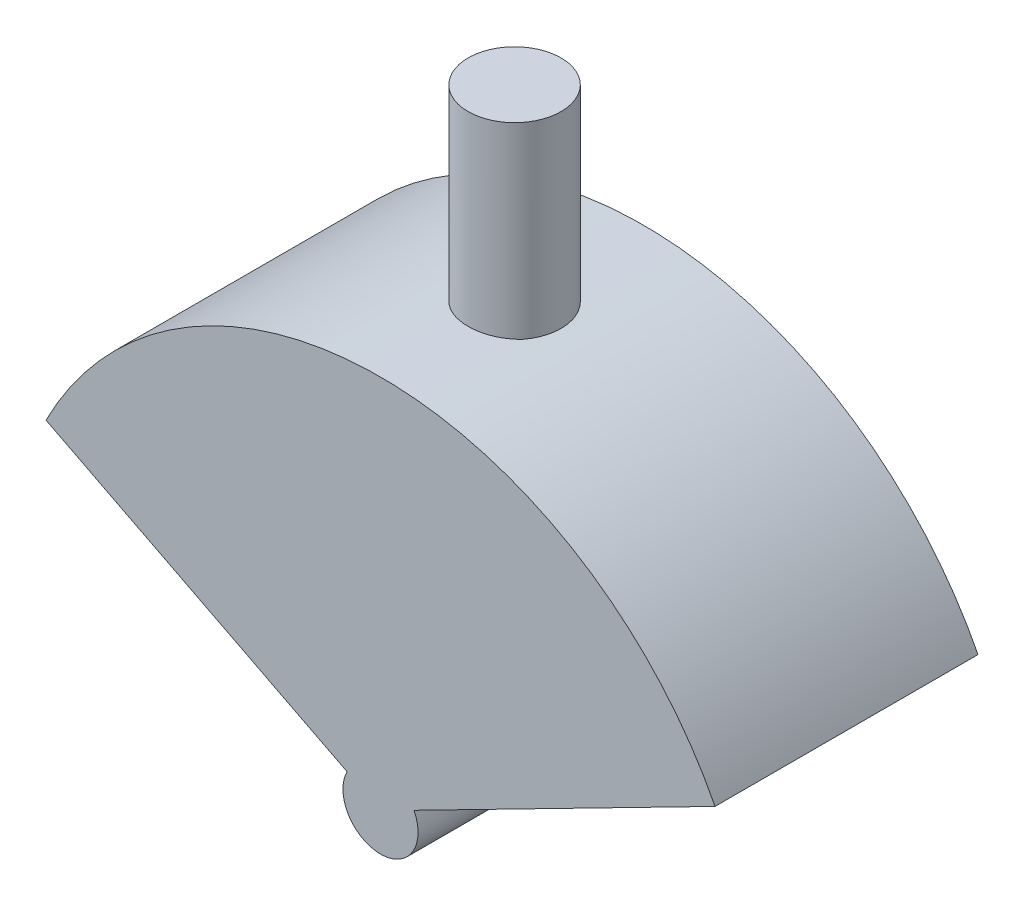
ISO-10303-21;
HEADER;
FILE_DESCRIPTION(('STEP AP214'),'2;1');
FILE_NAME('part.step','',(''),(''),'','','');
FILE_SCHEMA(('AUTOMOTIVE_DESIGN { 1 0 10303 214 1 1 1 1 }'));
ENDSEC;
DATA;
#1=APPLICATION_CONTEXT('core data for automotive mechanical design processes');
#2=APPLICATION_PROTOCOL_DEFINITION('international standard','automotive_design',2000,#1);
#3=PRODUCT_CONTEXT('',#1,'mechanical');
#4=PRODUCT('Part','Part','',(#3));
#5=PRODUCT_RELATED_PRODUCT_CATEGORY('part','',(#4));
#6=PRODUCT_DEFINITION_FORMATION('','',#4);
#7=PRODUCT_DEFINITION_CONTEXT('part definition',#1,'design');
#8=PRODUCT_DEFINITION('design','',#6,#7);
#9=PRODUCT_DEFINITION_SHAPE('','',#8);
#10=(LENGTH_UNIT() NAMED_UNIT(*) SI_UNIT(.MILLI.,.METRE.));
#11=(NAMED_UNIT(*) PLANE_ANGLE_UNIT() SI_UNIT($,.RADIAN.));
#12=(NAMED_UNIT(*) SI_UNIT($,.STERADIAN.) SOLID_ANGLE_UNIT());
#13=UNCERTAINTY_MEASURE_WITH_UNIT(LENGTH_MEASURE(1.E-05),#10,'distance_accuracy_value','');
#14=(GEOMETRIC_REPRESENTATION_CONTEXT(3) GLOBAL_UNCERTAINTY_ASSIGNED_CONTEXT((#13)) GLOBAL_UNIT_ASSIGNED_CONTEXT((#10,
#11,#12)) REPRESENTATION_CONTEXT('',''));
#15=CARTESIAN_POINT('',(0.,0.,0.));
#16=DIRECTION('',(0.,0.,1.));
#17=DIRECTION('',(1.,0.,0.));
#18=AXIS2_PLACEMENT_3D('',#15,#16,#17);
#19=CARTESIAN_POINT('',(0.,0.,35.));
#20=DIRECTION('',(0.,0.,-1.));
#21=DIRECTION('',(-1.,0.,0.));
#22=AXIS2_PLACEMENT_3D('',#19,#20,#21);
#23=CYLINDRICAL_SURFACE('',#22,50.);
#24=CARTESIAN_POINT('',(0.,0.,0.));
#25=DIRECTION('',(0.,0.,1.));
#26=DIRECTION('',(1.,0.,0.));
#27=AXIS2_PLACEMENT_3D('',#24,#25,#26);
#28=CIRCLE('',#27,50.);
#29=CARTESIAN_POINT('',(44.5203538997681,22.7582531983324,0.));
#30=VERTEX_POINT('',#29);
#31=CARTESIAN_POINT('',(-44.5203538997681,22.7582531983324,0.));
#32=VERTEX_POINT('',#31);
#33=EDGE_CURVE('E168',#30,#32,#28,.T.);
#34=ORIENTED_EDGE('',*,*,#33,.T.);
#35=DIRECTION('',(0.,0.,-1.));
#36=VECTOR('',#35,1.);
#37=CARTESIAN_POINT('',(-44.5203538997681,22.7582531983324,35.));
#38=LINE('',#37,#36);
#39=CARTESIAN_POINT('',(-44.5203538997681,22.7582531983324,35.));
#40=VERTEX_POINT('',#39);
#41=EDGE_CURVE('E166',#40,#32,#38,.T.);
#42=ORIENTED_EDGE('',*,*,#41,.F.);
#43=CARTESIAN_POINT('',(0.,0.,35.));
#44=DIRECTION('',(0.,0.,1.));
#45=DIRECTION('',(1.,0.,0.));
#46=AXIS2_PLACEMENT_3D('',#43,#44,#45);
#47=CIRCLE('',#46,50.);
#48=CARTESIAN_POINT('',(44.5203538997681,22.7582531983324,35.));
#49=VERTEX_POINT('',#48);
#50=EDGE_CURVE('E160',#49,#40,#47,.T.);
#51=ORIENTED_EDGE('',*,*,#50,.F.);
#52=DIRECTION('',(0.,0.,-1.));
#53=VECTOR('',#52,1.);
#54=CARTESIAN_POINT('',(44.5203538997681,22.7582531983324,35.));
#55=LINE('',#54,#53);
#56=EDGE_CURVE('E173',#49,#30,#55,.T.);
#57=ORIENTED_EDGE('',*,*,#56,.T.);
#58=EDGE_LOOP('',(#34,#42,#51,#57));
#59=FACE_BOUND('',#58,.T.);
#60=DIRECTION('',(0.,0.,-1.));
#61=VECTOR('',#60,1.);
#62=CARTESIAN_POINT('',(4.91211680804662,49.7581260545864,35.));
#63=LINE('',#62,#61);
#64=CARTESIAN_POINT('',(4.91211680804662,49.7581260545864,20.9213556774108));
#65=VERTEX_POINT('',#64);
#66=CARTESIAN_POINT('',(4.91211680804662,49.7581260545864,13.3931153032548));
#67=VERTEX_POINT('',#66);
#68=EDGE_CURVE('E11',#65,#67,#63,.T.);
#69=ORIENTED_EDGE('',*,*,#68,.F.);
#70=CARTESIAN_POINT('',(-4.91211680804662,49.7581260545864,20.9213556774108));
#71=CARTESIAN_POINT('',(-4.80620701915008,49.768581992461,21.0595951789052));
#72=CARTESIAN_POINT('',(-4.6944457010717,49.7792732648972,21.1933289110093));
#73=CARTESIAN_POINT('',(-4.46006910687504,49.8008194176482,21.4508976429164));
#74=CARTESIAN_POINT('',(-4.33745424601258,49.8116742916903,21.5747330210851));
#75=CARTESIAN_POINT('',(-4.08226643114797,49.8332367862117,21.8115775186441));
#76=CARTESIAN_POINT('',(-3.94969779104648,49.8439444681296,21.9245912802807));
#77=CARTESIAN_POINT('',(-3.67548822916328,49.8649144069012,22.1390595341949));
#78=CARTESIAN_POINT('',(-3.53384742874115,49.8751766697102,22.2405141810501));
#79=CARTESIAN_POINT('',(-3.24242903018518,49.894969553256,22.4311787549201));
#80=CARTESIAN_POINT('',(-3.09264852672002,49.9044999097829,22.5203842692097));
#81=CARTESIAN_POINT('',(-2.78599293414671,49.9225584189874,22.6858975734275));
#82=CARTESIAN_POINT('',(-2.62911524710225,49.9310862004923,22.7622005911538));
#83=CARTESIAN_POINT('',(-2.30953071719396,49.9468882304505,22.9012679367591));
#84=CARTESIAN_POINT('',(-2.14682776259052,49.9541632968979,22.9640411061105));
#85=CARTESIAN_POINT('',(-1.81659161435436,49.9672623676919,23.0756708580432));
#86=CARTESIAN_POINT('',(-1.64905667727406,49.9730858407866,23.124522346524));
#87=CARTESIAN_POINT('',(-1.3110879546694,49.9830922785509,23.2077484956979));
#88=CARTESIAN_POINT('',(-1.14066834288643,49.9872816736069,23.2421799420919));
#89=CARTESIAN_POINT('',(-0.797500502225785,49.9939340697915,23.2965894152695));
#90=CARTESIAN_POINT('',(-0.624752235587804,49.996397042891,23.3165672073921));
#91=CARTESIAN_POINT('',(-0.278153752977896,49.9995266779115,23.3419197344905));
#92=CARTESIAN_POINT('',(-0.104303428435538,50.0001931600035,23.3472930075515));
#93=CARTESIAN_POINT('',(0.243229966348021,49.9997103370352,23.3433918001177));
#94=CARTESIAN_POINT('',(0.416913037121793,49.998561037776,23.3341173664196));
#95=CARTESIAN_POINT('',(0.7618462770107,49.9944913583161,23.3010880399054));
#96=CARTESIAN_POINT('',(0.933104740989708,49.991581406325,23.2774184045198));
#97=CARTESIAN_POINT('',(1.27300297588202,49.9840810758099,23.2158480016475));
#98=CARTESIAN_POINT('',(1.44164279832232,49.9794907303948,23.1779475145517));
#99=CARTESIAN_POINT('',(1.77517227279307,49.9687563818222,23.0881790031677));
#100=CARTESIAN_POINT('',(1.94006065254528,49.9626118598904,23.0363063146708));
#101=CARTESIAN_POINT('',(2.26481312288888,49.9489442111383,22.9189982190943));
#102=CARTESIAN_POINT('',(2.42467899787396,49.9414215805716,22.853567693052));
#103=CARTESIAN_POINT('',(2.73881233313676,49.9251812329888,22.7093843772907));
#104=CARTESIAN_POINT('',(2.89306129753909,49.9164599525572,22.6305916939926));
#105=CARTESIAN_POINT('',(3.1943183180678,49.8980871306041,22.460417631336));
#106=CARTESIAN_POINT('',(3.34132898427833,49.888435928174,22.3690408355329));
#107=CARTESIAN_POINT('',(3.627058603943,49.8684764860698,22.1743862847947));
#108=CARTESIAN_POINT('',(3.7657828737228,49.8581686766238,22.0711162875079));
#109=CARTESIAN_POINT('',(4.03404059773329,49.8371810334588,21.8533871120754));
#110=CARTESIAN_POINT('',(4.16357753065753,49.8265013428574,21.7389322084392));
#111=CARTESIAN_POINT('',(4.40081014209718,49.8060806926605,21.5109459921894));
#112=CARTESIAN_POINT('',(4.50941228122517,49.7963466948666,21.3983552498156));
#113=CARTESIAN_POINT('',(4.71760098750933,49.7770545045737,21.1654911842859));
#114=CARTESIAN_POINT('',(4.81720395534327,49.7674960186319,21.0452325472429));
#115=CARTESIAN_POINT('',(4.91211680804662,49.7581260545864,20.9213556774108));
#116=B_SPLINE_CURVE_WITH_KNOTS('',3,(#70,#71,#72,#73,#74,#75,#76,#77,#78,#79,#80,#81,#82,#83,
#84,#85,#86,#87,#88,#89,#90,#91,#92,#93,#94,#95,#96,#97,#98,#99,#100,#101,#102,#103,#104,#105,
#106,#107,#108,#109,#110,#111,#112,#113,#114,#115),.UNSPECIFIED.,.F.,.F.,(4,2,2,2,2,2,2,2,2,2,2,
2,2,2,2,2,2,2,2,2,2,2,4),(0.,0.523220667167646,1.04642132459313,1.56939652488271,
2.09236473071928,2.61552084327804,3.13887003253789,3.66187618014962,4.18507345661864,
4.70619057105258,5.22731614584907,5.74849388348016,6.26966995605141,6.78778895537969,
7.30589774673161,7.82417970827913,8.34227540324886,8.86194605221607,9.38142791788532,
9.90057283700348,10.4195201258956,10.8892833054004,11.358172319868),.UNSPECIFIED.);
#117=CARTESIAN_POINT('',(-4.91211680804662,49.7581260545864,20.9213556774108));
#118=VERTEX_POINT('',#117);
#119=EDGE_CURVE('E41',#118,#65,#116,.T.);
#120=ORIENTED_EDGE('',*,*,#119,.F.);
#121=DIRECTION('',(0.,0.,-1.));
#122=VECTOR('',#121,1.);
#123=CARTESIAN_POINT('',(-4.91211680804662,49.7581260545864,35.));
#124=LINE('',#123,#122);
#125=CARTESIAN_POINT('',(-4.91211680804662,49.7581260545864,13.3931153032548));
#126=VERTEX_POINT('',#125);
#127=EDGE_CURVE('E104',#126,#118,#124,.F.);
#128=ORIENTED_EDGE('',*,*,#127,.F.);
#129=CARTESIAN_POINT('',(4.91211680804662,49.7581260545864,13.3931153032548));
#130=CARTESIAN_POINT('',(4.80620701915008,49.768581992461,13.2548758017605));
#131=CARTESIAN_POINT('',(4.6944457010717,49.7792732648972,13.1211420696564));
#132=CARTESIAN_POINT('',(4.46006910687504,49.8008194176482,12.8635733377493));
#133=CARTESIAN_POINT('',(4.33745424601258,49.8116742916903,12.7397379595806));
#134=CARTESIAN_POINT('',(4.08226643114798,49.8332367862117,12.5028934620215));
#135=CARTESIAN_POINT('',(3.94969779104648,49.8439444681296,12.389879700385));
#136=CARTESIAN_POINT('',(3.67548822916328,49.8649144069012,12.1754114464707));
#137=CARTESIAN_POINT('',(3.53384742874115,49.8751766697102,12.0739567996156));
#138=CARTESIAN_POINT('',(3.24242903018518,49.894969553256,11.8832922257455));
#139=CARTESIAN_POINT('',(3.09264852672002,49.9044999097829,11.7940867114559));
#140=CARTESIAN_POINT('',(2.78599293414671,49.9225584189874,11.6285734072381));
#141=CARTESIAN_POINT('',(2.62911524710225,49.9310862004923,11.5522703895119));
#142=CARTESIAN_POINT('',(2.30953071719396,49.9468882304505,11.4132030439065));
#143=CARTESIAN_POINT('',(2.14682776259052,49.9541632968979,11.3504298745551));
#144=CARTESIAN_POINT('',(1.81659161435436,49.9672623676919,11.2388001226225));
#145=CARTESIAN_POINT('',(1.64905667727406,49.9730858407866,11.1899486341416));
#146=CARTESIAN_POINT('',(1.3110879546694,49.9830922785509,11.1067224849677));
#147=CARTESIAN_POINT('',(1.14066834288643,49.9872816736069,11.0722910385738));
#148=CARTESIAN_POINT('',(0.797500502225787,49.9939340697915,11.0178815653962));
#149=CARTESIAN_POINT('',(0.624752235587806,49.996397042891,10.9979037732736));
#150=CARTESIAN_POINT('',(0.278153752977897,49.9995266779115,10.9725512461752));
#151=CARTESIAN_POINT('',(0.104303428435539,50.0001931600035,10.9671779731142));
#152=CARTESIAN_POINT('',(-0.243229966348021,49.9997103370352,10.9710791805479));
#153=CARTESIAN_POINT('',(-0.416913037121793,49.998561037776,10.9803536142461));
#154=CARTESIAN_POINT('',(-0.761846277010699,49.9944913583161,11.0133829407602));
#155=CARTESIAN_POINT('',(-0.933104740989707,49.991581406325,11.0370525761458));
#156=CARTESIAN_POINT('',(-1.27300297588202,49.9840810758099,11.0986229790181));
#157=CARTESIAN_POINT('',(-1.44164279832232,49.9794907303948,11.1365234661139));
#158=CARTESIAN_POINT('',(-1.77517227279307,49.9687563818222,11.226291977498));
#159=CARTESIAN_POINT('',(-1.94006065254528,49.9626118598904,11.2781646659948));
#160=CARTESIAN_POINT('',(-2.26481312288888,49.9489442111383,11.3954727615714));
#161=CARTESIAN_POINT('',(-2.42467899787396,49.9414215805716,11.4609032876136));
#162=CARTESIAN_POINT('',(-2.73881233313676,49.9251812329888,11.605086603375));
#163=CARTESIAN_POINT('',(-2.89306129753908,49.9164599525572,11.6838792866731));
#164=CARTESIAN_POINT('',(-3.1943183180678,49.8980871306041,11.8540533493296));
#165=CARTESIAN_POINT('',(-3.34132898427833,49.888435928174,11.9454301451327));
#166=CARTESIAN_POINT('',(-3.627058603943,49.8684764860698,12.1400846958709));
#167=CARTESIAN_POINT('',(-3.7657828737228,49.8581686766238,12.2433546931578));
#168=CARTESIAN_POINT('',(-4.03404059773329,49.8371810334588,12.4610838685902));
#169=CARTESIAN_POINT('',(-4.16357753065753,49.8265013428574,12.5755387722265));
#170=CARTESIAN_POINT('',(-4.40081014209718,49.8060806926605,12.8035249884763));
#171=CARTESIAN_POINT('',(-4.50941228122517,49.7963466948666,12.9161157308501));
#172=CARTESIAN_POINT('',(-4.71760098750933,49.7770545045737,13.1489797963797));
#173=CARTESIAN_POINT('',(-4.81720395534327,49.7674960186319,13.2692384334227));
#174=CARTESIAN_POINT('',(-4.91211680804662,49.7581260545864,13.3931153032548));
#175=B_SPLINE_CURVE_WITH_KNOTS('',3,(#129,#130,#131,#132,#133,#134,#135,#136,#137,#138,#139,
#140,#141,#142,#143,#144,#145,#146,#147,#148,#149,#150,#151,#152,#153,#154,#155,#156,#157,#158,
#159,#160,#161,#162,#163,#164,#165,#166,#167,#168,#169,#170,#171,#172,#173,#174),.UNSPECIFIED.,
.F.,.F.,(4,2,2,2,2,2,2,2,2,2,2,2,2,2,2,2,2,2,2,2,2,2,4),(0.,0.523220667167642,1.04642132459313,
1.56939652488271,2.09236473071928,2.61552084327804,3.13887003253789,3.66187618014962,
4.18507345661864,4.70619057105258,5.22731614584906,5.74849388348016,6.26966995605141,
6.78778895537969,7.30589774673161,7.82417970827912,8.34227540324885,8.86194605221606,
9.38142791788532,9.90057283700348,10.4195201258956,10.8892833054004,11.358172319868),.UNSPECIFIED.);
#176=EDGE_CURVE('E51',#67,#126,#175,.T.);
#177=ORIENTED_EDGE('',*,*,#176,.F.);
#178=EDGE_LOOP('',(#69,#120,#128,#177));
#179=FACE_BOUND('',#178,.T.);
#180=ADVANCED_FACE('F33',(#59,#179),#23,.T.);
#181=CARTESIAN_POINT('',(0.,0.,35.));
#182=DIRECTION('',(-0.455165063966648,0.890407077995361,0.));
#183=DIRECTION('',(-0.890407077995361,-0.455165063966648,0.));
#184=AXIS2_PLACEMENT_3D('',#181,#182,#183);
#185=PLANE('',#184);
#186=DIRECTION('',(0.890407077995361,0.455165063966648,0.));
#187=VECTOR('',#186,1.);
#188=CARTESIAN_POINT('',(0.,0.,35.));
#189=LINE('',#188,#187);
#190=CARTESIAN_POINT('',(4.45203538997681,2.27582531983324,35.));
#191=VERTEX_POINT('',#190);
#192=EDGE_CURVE('E158',#191,#49,#189,.T.);
#193=ORIENTED_EDGE('',*,*,#192,.F.);
#194=DIRECTION('',(0.,0.,1.));
#195=VECTOR('',#194,1.);
#196=CARTESIAN_POINT('',(4.45203538997681,2.27582531983324,0.));
#197=LINE('',#196,#195);
#198=CARTESIAN_POINT('',(4.45203538997681,2.27582531983324,33.));
#199=VERTEX_POINT('',#198);
#200=EDGE_CURVE('E134',#191,#199,#197,.F.);
#201=ORIENTED_EDGE('',*,*,#200,.T.);
#202=DIRECTION('',(0.890407077995361,0.455165063966648,0.));
#203=VECTOR('',#202,1.);
#204=CARTESIAN_POINT('',(0.,0.,33.));
#205=LINE('',#204,#203);
#206=CARTESIAN_POINT('',(42.7395397437773,21.8479230703991,33.));
#207=VERTEX_POINT('',#206);
#208=EDGE_CURVE('E145',#199,#207,#205,.T.);
#209=ORIENTED_EDGE('',*,*,#208,.T.);
#210=DIRECTION('',(0.,0.,-1.));
#211=VECTOR('',#210,1.);
#212=CARTESIAN_POINT('',(42.7395397437773,21.8479230703991,33.));
#213=LINE('',#212,#211);
#214=CARTESIAN_POINT('',(42.7395397437773,21.8479230703991,2.));
#215=VERTEX_POINT('',#214);
#216=EDGE_CURVE('E149',#207,#215,#213,.T.);
#217=ORIENTED_EDGE('',*,*,#216,.T.);
#218=DIRECTION('',(0.890407077995361,0.455165063966648,0.));
#219=VECTOR('',#218,1.);
#220=CARTESIAN_POINT('',(0.,0.,2.));
#221=LINE('',#220,#219);
#222=CARTESIAN_POINT('',(4.45203538997681,2.27582531983324,2.));
#223=VERTEX_POINT('',#222);
#224=EDGE_CURVE('E140',#223,#215,#221,.T.);
#225=ORIENTED_EDGE('',*,*,#224,.F.);
#226=CARTESIAN_POINT('',(4.45203538997681,2.27582531983324,0.));
#227=VERTEX_POINT('',#226);
#228=EDGE_CURVE('E130',#223,#227,#197,.F.);
#229=ORIENTED_EDGE('',*,*,#228,.T.);
#230=DIRECTION('',(0.890407077995361,0.455165063966648,0.));
#231=VECTOR('',#230,1.);
#232=CARTESIAN_POINT('',(0.,0.,0.));
#233=LINE('',#232,#231);
#234=EDGE_CURVE('E154',#227,#30,#233,.T.);
#235=ORIENTED_EDGE('',*,*,#234,.T.);
#236=ORIENTED_EDGE('',*,*,#56,.F.);
#237=EDGE_LOOP('',(#193,#201,#209,#217,#225,#229,#235,#236));
#238=FACE_BOUND('',#237,.T.);
#239=ADVANCED_FACE('F35',(#238),#185,.F.);
#240=CARTESIAN_POINT('',(0.,0.,35.));
#241=DIRECTION('',(0.455165063966648,0.890407077995361,0.));
#242=DIRECTION('',(-0.890407077995361,0.455165063966648,0.));
#243=AXIS2_PLACEMENT_3D('',#240,#241,#242);
#244=PLANE('',#243);
#245=DIRECTION('',(0.890407077995361,-0.455165063966648,0.));
#246=VECTOR('',#245,1.);
#247=CARTESIAN_POINT('',(0.,0.,0.));
#248=LINE('',#247,#246);
#249=CARTESIAN_POINT('',(-4.45203538997681,2.27582531983324,0.));
#250=VERTEX_POINT('',#249);
#251=EDGE_CURVE('E161',#32,#250,#248,.T.);
#252=ORIENTED_EDGE('',*,*,#251,.T.);
#253=DIRECTION('',(0.,0.,1.));
#254=VECTOR('',#253,1.);
#255=CARTESIAN_POINT('',(-4.45203538997681,2.27582531983324,0.));
#256=LINE('',#255,#254);
#257=CARTESIAN_POINT('',(-4.45203538997681,2.27582531983324,2.));
#258=VERTEX_POINT('',#257);
#259=EDGE_CURVE('E124',#250,#258,#256,.T.);
#260=ORIENTED_EDGE('',*,*,#259,.T.);
#261=DIRECTION('',(0.890407077995361,-0.455165063966648,0.));
#262=VECTOR('',#261,1.);
#263=CARTESIAN_POINT('',(0.,0.,2.));
#264=LINE('',#263,#262);
#265=CARTESIAN_POINT('',(-42.7395397437773,21.8479230703991,2.));
#266=VERTEX_POINT('',#265);
#267=EDGE_CURVE('E139',#266,#258,#264,.T.);
#268=ORIENTED_EDGE('',*,*,#267,.F.);
#269=DIRECTION('',(0.,0.,-1.));
#270=VECTOR('',#269,1.);
#271=CARTESIAN_POINT('',(-42.7395397437773,21.8479230703991,33.));
#272=LINE('',#271,#270);
#273=CARTESIAN_POINT('',(-42.7395397437773,21.8479230703991,33.));
#274=VERTEX_POINT('',#273);
#275=EDGE_CURVE('E146',#274,#266,#272,.T.);
#276=ORIENTED_EDGE('',*,*,#275,.F.);
#277=DIRECTION('',(0.890407077995361,-0.455165063966648,0.));
#278=VECTOR('',#277,1.);
#279=CARTESIAN_POINT('',(0.,0.,33.));
#280=LINE('',#279,#278);
#281=CARTESIAN_POINT('',(-4.45203538997681,2.27582531983324,33.));
#282=VERTEX_POINT('',#281);
#283=EDGE_CURVE('E144',#274,#282,#280,.T.);
#284=ORIENTED_EDGE('',*,*,#283,.T.);
#285=CARTESIAN_POINT('',(-4.45203538997681,2.27582531983324,35.));
#286=VERTEX_POINT('',#285);
#287=EDGE_CURVE('E131',#282,#286,#256,.T.);
#288=ORIENTED_EDGE('',*,*,#287,.T.);
#289=DIRECTION('',(0.890407077995361,-0.455165063966648,0.));
#290=VECTOR('',#289,1.);
#291=CARTESIAN_POINT('',(0.,0.,35.));
#292=LINE('',#291,#290);
#293=EDGE_CURVE('E163',#40,#286,#292,.T.);
#294=ORIENTED_EDGE('',*,*,#293,.F.);
#295=ORIENTED_EDGE('',*,*,#41,.T.);
#296=EDGE_LOOP('',(#252,#260,#268,#276,#284,#288,#294,#295));
#297=FACE_BOUND('',#296,.T.);
#298=ADVANCED_FACE('F217',(#297),#244,.F.);
#299=CARTESIAN_POINT('',(0.,0.,35.));
#300=DIRECTION('',(0.,0.,1.));
#301=DIRECTION('',(1.,0.,0.));
#302=AXIS2_PLACEMENT_3D('',#299,#300,#301);
#303=PLANE('',#302);
#304=CARTESIAN_POINT('',(0.,0.,35.));
#305=DIRECTION('',(0.,0.,1.));
#306=DIRECTION('',(1.,0.,0.));
#307=AXIS2_PLACEMENT_3D('',#304,#305,#306);
#308=CIRCLE('',#307,5.);
#309=EDGE_CURVE('E125',#286,#191,#308,.T.);
#310=ORIENTED_EDGE('',*,*,#309,.T.);
#311=ORIENTED_EDGE('',*,*,#192,.T.);
#312=ORIENTED_EDGE('',*,*,#50,.T.);
#313=ORIENTED_EDGE('',*,*,#293,.T.);
#314=EDGE_LOOP('',(#310,#311,#312,#313));
#315=FACE_BOUND('',#314,.T.);
#316=ADVANCED_FACE('F214',(#315),#303,.T.);
#317=CARTESIAN_POINT('',(0.,0.,0.));
#318=DIRECTION('',(0.,0.,1.));
#319=DIRECTION('',(1.,0.,0.));
#320=AXIS2_PLACEMENT_3D('',#317,#318,#319);
#321=PLANE('',#320);
#322=ORIENTED_EDGE('',*,*,#234,.F.);
#323=CARTESIAN_POINT('',(0.,0.,0.));
#324=DIRECTION('',(0.,0.,1.));
#325=DIRECTION('',(1.,0.,0.));
#326=AXIS2_PLACEMENT_3D('',#323,#324,#325);
#327=CIRCLE('',#326,5.);
#328=EDGE_CURVE('E121',#250,#227,#327,.T.);
#329=ORIENTED_EDGE('',*,*,#328,.F.);
#330=ORIENTED_EDGE('',*,*,#251,.F.);
#331=ORIENTED_EDGE('',*,*,#33,.F.);
#332=EDGE_LOOP('',(#322,#329,#330,#331));
#333=FACE_BOUND('',#332,.T.);
#334=ADVANCED_FACE('F206',(#333),#321,.F.);
#335=CARTESIAN_POINT('',(0.,0.,35.));
#336=DIRECTION('',(0.,0.,-1.));
#337=DIRECTION('',(-1.,0.,0.));
#338=AXIS2_PLACEMENT_3D('',#335,#336,#337);
#339=CYLINDRICAL_SURFACE('',#338,48.);
#340=CARTESIAN_POINT('',(0.,0.,2.));
#341=DIRECTION('',(0.,0.,1.));
#342=DIRECTION('',(1.,0.,0.));
#343=AXIS2_PLACEMENT_3D('',#340,#341,#342);
#344=CIRCLE('',#343,48.);
#345=EDGE_CURVE('E137',#215,#266,#344,.T.);
#346=ORIENTED_EDGE('',*,*,#345,.F.);
#347=ORIENTED_EDGE('',*,*,#216,.F.);
#348=CARTESIAN_POINT('',(0.,0.,33.));
#349=DIRECTION('',(0.,0.,1.));
#350=DIRECTION('',(1.,0.,0.));
#351=AXIS2_PLACEMENT_3D('',#348,#349,#350);
#352=CIRCLE('',#351,48.);
#353=EDGE_CURVE('E141',#207,#274,#352,.T.);
#354=ORIENTED_EDGE('',*,*,#353,.T.);
#355=ORIENTED_EDGE('',*,*,#275,.T.);
#356=EDGE_LOOP('',(#346,#347,#354,#355));
#357=FACE_BOUND('',#356,.T.);
#358=ADVANCED_FACE('F202',(#357),#339,.F.);
#359=CARTESIAN_POINT('',(0.,0.,33.));
#360=DIRECTION('',(0.,0.,1.));
#361=DIRECTION('',(1.,0.,0.));
#362=AXIS2_PLACEMENT_3D('',#359,#360,#361);
#363=PLANE('',#362);
#364=ORIENTED_EDGE('',*,*,#208,.F.);
#365=CARTESIAN_POINT('',(0.,0.,33.));
#366=DIRECTION('',(0.,0.,1.));
#367=DIRECTION('',(1.,0.,0.));
#368=AXIS2_PLACEMENT_3D('',#365,#366,#367);
#369=CIRCLE('',#368,5.);
#370=EDGE_CURVE('E133',#199,#282,#369,.T.);
#371=ORIENTED_EDGE('',*,*,#370,.T.);
#372=ORIENTED_EDGE('',*,*,#283,.F.);
#373=ORIENTED_EDGE('',*,*,#353,.F.);
#374=EDGE_LOOP('',(#364,#371,#372,#373));
#375=FACE_BOUND('',#374,.T.);
#376=ADVANCED_FACE('F205',(#375),#363,.F.);
#377=CARTESIAN_POINT('',(0.,0.,2.));
#378=DIRECTION('',(0.,0.,1.));
#379=DIRECTION('',(1.,0.,0.));
#380=AXIS2_PLACEMENT_3D('',#377,#378,#379);
#381=PLANE('',#380);
#382=CARTESIAN_POINT('',(0.,0.,2.));
#383=DIRECTION('',(0.,0.,1.));
#384=DIRECTION('',(1.,0.,0.));
#385=AXIS2_PLACEMENT_3D('',#382,#383,#384);
#386=CIRCLE('',#385,5.);
#387=EDGE_CURVE('E113',#223,#258,#386,.T.);
#388=ORIENTED_EDGE('',*,*,#387,.F.);
#389=ORIENTED_EDGE('',*,*,#224,.T.);
#390=ORIENTED_EDGE('',*,*,#345,.T.);
#391=ORIENTED_EDGE('',*,*,#267,.T.);
#392=EDGE_LOOP('',(#388,#389,#390,#391));
#393=FACE_BOUND('',#392,.T.);
#394=ADVANCED_FACE('F200',(#393),#381,.T.);
#395=CARTESIAN_POINT('',(0.,0.,0.));
#396=DIRECTION('',(0.,0.,1.));
#397=DIRECTION('',(1.,0.,0.));
#398=AXIS2_PLACEMENT_3D('',#395,#396,#397);
#399=CYLINDRICAL_SURFACE('',#398,5.);
#400=ORIENTED_EDGE('',*,*,#228,.F.);
#401=ORIENTED_EDGE('',*,*,#387,.T.);
#402=ORIENTED_EDGE('',*,*,#259,.F.);
#403=ORIENTED_EDGE('',*,*,#328,.T.);
#404=EDGE_LOOP('',(#400,#401,#402,#403));
#405=FACE_BOUND('',#404,.T.);
#406=ORIENTED_EDGE('',*,*,#200,.F.);
#407=ORIENTED_EDGE('',*,*,#309,.F.);
#408=ORIENTED_EDGE('',*,*,#287,.F.);
#409=ORIENTED_EDGE('',*,*,#370,.F.);
#410=EDGE_LOOP('',(#406,#407,#408,#409));
#411=FACE_BOUND('',#410,.T.);
#412=ADVANCED_FACE('F194',(#405,#411),#399,.T.);
#413=CARTESIAN_POINT('',(0.,74.7581260545864,17.1572354903328));
#414=DIRECTION('',(0.,-1.,0.));
#415=DIRECTION('',(0.,0.,-1.));
#416=AXIS2_PLACEMENT_3D('',#413,#414,#415);
#417=CYLINDRICAL_SURFACE('',#416,6.18849677374581);
#418=CARTESIAN_POINT('',(0.,74.7581260545864,17.1572354903328));
#419=DIRECTION('',(0.,1.,0.));
#420=DIRECTION('',(0.,0.,1.));
#421=AXIS2_PLACEMENT_3D('',#418,#419,#420);
#422=CIRCLE('',#421,6.18849677374581);
#423=CARTESIAN_POINT('',(0.,74.7581260545864,23.3457322640786));
#424=VERTEX_POINT('',#423);
#425=EDGE_CURVE('E118',#424,#424,#422,.T.);
#426=ORIENTED_EDGE('',*,*,#425,.F.);
#427=EDGE_LOOP('',(#426));
#428=FACE_BOUND('',#427,.T.);
#429=CARTESIAN_POINT('',(0.,49.7581260545864,17.1572354903328));
#430=DIRECTION('',(0.,1.,0.));
#431=DIRECTION('',(0.,0.,1.));
#432=AXIS2_PLACEMENT_3D('',#429,#430,#431);
#433=CIRCLE('',#432,6.18849677374581);
#434=EDGE_CURVE('E112',#126,#118,#433,.T.);
#435=ORIENTED_EDGE('',*,*,#434,.T.);
#436=ORIENTED_EDGE('',*,*,#119,.T.);
#437=EDGE_CURVE('E116',#65,#67,#433,.T.);
#438=ORIENTED_EDGE('',*,*,#437,.T.);
#439=ORIENTED_EDGE('',*,*,#176,.T.);
#440=EDGE_LOOP('',(#435,#436,#438,#439));
#441=FACE_BOUND('',#440,.T.);
#442=ADVANCED_FACE('F115',(#428,#441),#417,.T.);
#443=CARTESIAN_POINT('',(0.,49.7581260545864,17.1572354903328));
#444=DIRECTION('',(0.,1.,0.));
#445=DIRECTION('',(0.,0.,1.));
#446=AXIS2_PLACEMENT_3D('',#443,#444,#445);
#447=PLANE('',#446);
#448=ORIENTED_EDGE('',*,*,#437,.F.);
#449=ORIENTED_EDGE('',*,*,#68,.T.);
#450=EDGE_LOOP('',(#448,#449));
#451=FACE_BOUND('',#450,.T.);
#452=ADVANCED_FACE('F193',(#451),#447,.F.);
#453=ORIENTED_EDGE('',*,*,#434,.F.);
#454=ORIENTED_EDGE('',*,*,#127,.T.);
#455=EDGE_LOOP('',(#453,#454));
#456=FACE_BOUND('',#455,.T.);
#457=ADVANCED_FACE('F111',(#456),#447,.F.);
#458=CARTESIAN_POINT('',(0.,74.7581260545864,17.1572354903328));
#459=DIRECTION('',(0.,1.,0.));
#460=DIRECTION('',(0.,0.,1.));
#461=AXIS2_PLACEMENT_3D('',#458,#459,#460);
#462=PLANE('',#461);
#463=ORIENTED_EDGE('',*,*,#425,.T.);
#464=EDGE_LOOP('',(#463));
#465=FACE_BOUND('',#464,.T.);
#466=ADVANCED_FACE('F313',(#465),#462,.T.);
#467=CLOSED_SHELL('',(#180,#239,#298,#316,#334,#358,#376,#394,#412,#442,#452,#457,#466));
#468=MANIFOLD_SOLID_BREP('B2',#467);
#469=ADVANCED_BREP_SHAPE_REPRESENTATION('',(#18,#468),#14);
#470=SHAPE_DEFINITION_REPRESENTATION(#9,#469);
ENDSEC;
END-ISO-10303-21;
